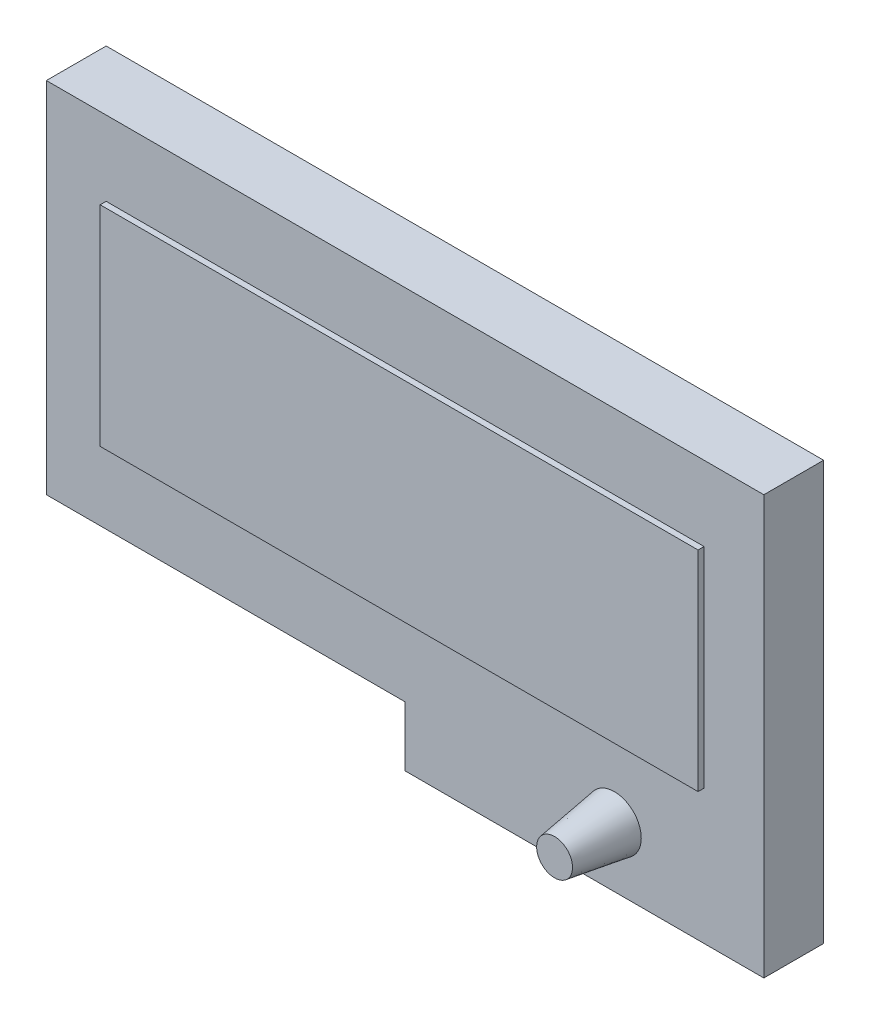
ISO-10303-21;
HEADER;
FILE_DESCRIPTION(('STEP AP214'),'2;1');
FILE_NAME('part.step','',(''),(''),'','','');
FILE_SCHEMA(('AUTOMOTIVE_DESIGN { 1 0 10303 214 1 1 1 1 }'));
ENDSEC;
DATA;
#1=APPLICATION_CONTEXT('core data for automotive mechanical design processes');
#2=APPLICATION_PROTOCOL_DEFINITION('international standard','automotive_design',2000,#1);
#3=PRODUCT_CONTEXT('',#1,'mechanical');
#4=PRODUCT('Part','Part','',(#3));
#5=PRODUCT_RELATED_PRODUCT_CATEGORY('part','',(#4));
#6=PRODUCT_DEFINITION_FORMATION('','',#4);
#7=PRODUCT_DEFINITION_CONTEXT('part definition',#1,'design');
#8=PRODUCT_DEFINITION('design','',#6,#7);
#9=PRODUCT_DEFINITION_SHAPE('','',#8);
#10=(LENGTH_UNIT() NAMED_UNIT(*) SI_UNIT(.MILLI.,.METRE.));
#11=(NAMED_UNIT(*) PLANE_ANGLE_UNIT() SI_UNIT($,.RADIAN.));
#12=(NAMED_UNIT(*) SI_UNIT($,.STERADIAN.) SOLID_ANGLE_UNIT());
#13=UNCERTAINTY_MEASURE_WITH_UNIT(LENGTH_MEASURE(1.E-05),#10,'distance_accuracy_value','');
#14=(GEOMETRIC_REPRESENTATION_CONTEXT(3) GLOBAL_UNCERTAINTY_ASSIGNED_CONTEXT((#13)) GLOBAL_UNIT_ASSIGNED_CONTEXT((#10,
#11,#12)) REPRESENTATION_CONTEXT('',''));
#15=CARTESIAN_POINT('',(0.,0.,0.));
#16=DIRECTION('',(0.,0.,1.));
#17=DIRECTION('',(1.,0.,0.));
#18=AXIS2_PLACEMENT_3D('',#15,#16,#17);
#19=CARTESIAN_POINT('',(0.,0.,10.));
#20=DIRECTION('',(0.,0.,1.));
#21=DIRECTION('',(1.,0.,0.));
#22=AXIS2_PLACEMENT_3D('',#19,#20,#21);
#23=PLANE('',#22);
#24=DIRECTION('',(1.,0.,0.));
#25=VECTOR('',#24,1.);
#26=CARTESIAN_POINT('',(-50.,12.5,10.));
#27=LINE('',#26,#25);
#28=CARTESIAN_POINT('',(-50.,12.5,10.));
#29=VERTEX_POINT('',#28);
#30=CARTESIAN_POINT('',(50.,12.5,10.));
#31=VERTEX_POINT('',#30);
#32=EDGE_CURVE('E178',#29,#31,#27,.T.);
#33=ORIENTED_EDGE('',*,*,#32,.F.);
#34=DIRECTION('',(0.,-1.,0.));
#35=VECTOR('',#34,1.);
#36=CARTESIAN_POINT('',(-50.,47.5,10.));
#37=LINE('',#36,#35);
#38=CARTESIAN_POINT('',(-50.,47.5,10.));
#39=VERTEX_POINT('',#38);
#40=EDGE_CURVE('E181',#39,#29,#37,.T.);
#41=ORIENTED_EDGE('',*,*,#40,.F.);
#42=DIRECTION('',(-1.,0.,0.));
#43=VECTOR('',#42,1.);
#44=CARTESIAN_POINT('',(-50.,47.5,10.));
#45=LINE('',#44,#43);
#46=CARTESIAN_POINT('',(50.,47.5,10.));
#47=VERTEX_POINT('',#46);
#48=EDGE_CURVE('E173',#47,#39,#45,.T.);
#49=ORIENTED_EDGE('',*,*,#48,.F.);
#50=DIRECTION('',(0.,1.,0.));
#51=VECTOR('',#50,1.);
#52=CARTESIAN_POINT('',(50.,47.5,10.));
#53=LINE('',#52,#51);
#54=EDGE_CURVE('E176',#31,#47,#53,.T.);
#55=ORIENTED_EDGE('',*,*,#54,.F.);
#56=EDGE_LOOP('',(#33,#41,#49,#55));
#57=FACE_BOUND('',#56,.T.);
#58=DIRECTION('',(-1.,0.,0.));
#59=VECTOR('',#58,1.);
#60=CARTESIAN_POINT('',(60.,60.,10.));
#61=LINE('',#60,#59);
#62=CARTESIAN_POINT('',(60.,60.,10.));
#63=VERTEX_POINT('',#62);
#64=CARTESIAN_POINT('',(-60.,60.,10.));
#65=VERTEX_POINT('',#64);
#66=EDGE_CURVE('E146',#63,#65,#61,.T.);
#67=ORIENTED_EDGE('',*,*,#66,.T.);
#68=DIRECTION('',(0.,-1.,0.));
#69=VECTOR('',#68,1.);
#70=CARTESIAN_POINT('',(-60.,60.,10.));
#71=LINE('',#70,#69);
#72=CARTESIAN_POINT('',(-60.,0.,10.));
#73=VERTEX_POINT('',#72);
#74=EDGE_CURVE('E95',#65,#73,#71,.T.);
#75=ORIENTED_EDGE('',*,*,#74,.T.);
#76=DIRECTION('',(1.,0.,0.));
#77=VECTOR('',#76,1.);
#78=CARTESIAN_POINT('',(-60.,0.,10.));
#79=LINE('',#78,#77);
#80=CARTESIAN_POINT('',(0.,0.,10.));
#81=VERTEX_POINT('',#80);
#82=EDGE_CURVE('E112',#73,#81,#79,.T.);
#83=ORIENTED_EDGE('',*,*,#82,.T.);
#84=DIRECTION('',(0.,-1.,0.));
#85=VECTOR('',#84,1.);
#86=CARTESIAN_POINT('',(0.,0.,10.));
#87=LINE('',#86,#85);
#88=CARTESIAN_POINT('',(0.,-10.,10.));
#89=VERTEX_POINT('',#88);
#90=EDGE_CURVE('E105',#81,#89,#87,.T.);
#91=ORIENTED_EDGE('',*,*,#90,.T.);
#92=DIRECTION('',(1.,0.,0.));
#93=VECTOR('',#92,1.);
#94=CARTESIAN_POINT('',(0.,-10.,10.));
#95=LINE('',#94,#93);
#96=CARTESIAN_POINT('',(60.,-10.,10.));
#97=VERTEX_POINT('',#96);
#98=EDGE_CURVE('E109',#89,#97,#95,.T.);
#99=ORIENTED_EDGE('',*,*,#98,.T.);
#100=DIRECTION('',(0.,1.,0.));
#101=VECTOR('',#100,1.);
#102=CARTESIAN_POINT('',(60.,-10.,10.));
#103=LINE('',#102,#101);
#104=EDGE_CURVE('E61',#97,#63,#103,.T.);
#105=ORIENTED_EDGE('',*,*,#104,.T.);
#106=EDGE_LOOP('',(#67,#75,#83,#91,#99,#105));
#107=FACE_BOUND('',#106,.T.);
#108=CARTESIAN_POINT('',(35.,0.,10.));
#109=DIRECTION('',(0.,0.,1.));
#110=DIRECTION('',(1.,0.,0.));
#111=AXIS2_PLACEMENT_3D('',#108,#109,#110);
#112=CIRCLE('',#111,4.5);
#113=CARTESIAN_POINT('',(39.5,0.,10.));
#114=VERTEX_POINT('',#113);
#115=EDGE_CURVE('E184',#114,#114,#112,.T.);
#116=ORIENTED_EDGE('',*,*,#115,.F.);
#117=EDGE_LOOP('',(#116));
#118=FACE_BOUND('',#117,.T.);
#119=ADVANCED_FACE('F37',(#57,#107,#118),#23,.T.);
#120=CARTESIAN_POINT('',(60.,60.,10.));
#121=DIRECTION('',(0.,-1.,0.));
#122=DIRECTION('',(1.,0.,0.));
#123=AXIS2_PLACEMENT_3D('',#120,#121,#122);
#124=PLANE('',#123);
#125=DIRECTION('',(-1.,0.,0.));
#126=VECTOR('',#125,1.);
#127=CARTESIAN_POINT('',(60.,60.,0.));
#128=LINE('',#127,#126);
#129=CARTESIAN_POINT('',(60.,60.,0.));
#130=VERTEX_POINT('',#129);
#131=CARTESIAN_POINT('',(-60.,60.,0.));
#132=VERTEX_POINT('',#131);
#133=EDGE_CURVE('E134',#130,#132,#128,.T.);
#134=ORIENTED_EDGE('',*,*,#133,.T.);
#135=DIRECTION('',(0.,0.,-1.));
#136=VECTOR('',#135,1.);
#137=CARTESIAN_POINT('',(-60.,60.,10.));
#138=LINE('',#137,#136);
#139=EDGE_CURVE('E12',#65,#132,#138,.T.);
#140=ORIENTED_EDGE('',*,*,#139,.F.);
#141=ORIENTED_EDGE('',*,*,#66,.F.);
#142=DIRECTION('',(0.,0.,-1.));
#143=VECTOR('',#142,1.);
#144=CARTESIAN_POINT('',(60.,60.,10.));
#145=LINE('',#144,#143);
#146=EDGE_CURVE('E130',#63,#130,#145,.T.);
#147=ORIENTED_EDGE('',*,*,#146,.T.);
#148=EDGE_LOOP('',(#134,#140,#141,#147));
#149=FACE_BOUND('',#148,.T.);
#150=ADVANCED_FACE('F39',(#149),#124,.F.);
#151=CARTESIAN_POINT('',(-60.,60.,10.));
#152=DIRECTION('',(1.,0.,0.));
#153=DIRECTION('',(0.,1.,0.));
#154=AXIS2_PLACEMENT_3D('',#151,#152,#153);
#155=PLANE('',#154);
#156=DIRECTION('',(0.,-1.,0.));
#157=VECTOR('',#156,1.);
#158=CARTESIAN_POINT('',(-60.,60.,0.));
#159=LINE('',#158,#157);
#160=CARTESIAN_POINT('',(-60.,0.,0.));
#161=VERTEX_POINT('',#160);
#162=EDGE_CURVE('E137',#132,#161,#159,.T.);
#163=ORIENTED_EDGE('',*,*,#162,.T.);
#164=DIRECTION('',(0.,0.,-1.));
#165=VECTOR('',#164,1.);
#166=CARTESIAN_POINT('',(-60.,0.,10.));
#167=LINE('',#166,#165);
#168=EDGE_CURVE('E45',#73,#161,#167,.T.);
#169=ORIENTED_EDGE('',*,*,#168,.F.);
#170=ORIENTED_EDGE('',*,*,#74,.F.);
#171=ORIENTED_EDGE('',*,*,#139,.T.);
#172=EDGE_LOOP('',(#163,#169,#170,#171));
#173=FACE_BOUND('',#172,.T.);
#174=ADVANCED_FACE('F249',(#173),#155,.F.);
#175=CARTESIAN_POINT('',(-60.,0.,10.));
#176=DIRECTION('',(0.,1.,0.));
#177=DIRECTION('',(-1.,0.,0.));
#178=AXIS2_PLACEMENT_3D('',#175,#176,#177);
#179=PLANE('',#178);
#180=DIRECTION('',(1.,0.,0.));
#181=VECTOR('',#180,1.);
#182=CARTESIAN_POINT('',(-60.,0.,0.));
#183=LINE('',#182,#181);
#184=CARTESIAN_POINT('',(0.,0.,0.));
#185=VERTEX_POINT('',#184);
#186=EDGE_CURVE('E140',#161,#185,#183,.T.);
#187=ORIENTED_EDGE('',*,*,#186,.T.);
#188=DIRECTION('',(0.,0.,-1.));
#189=VECTOR('',#188,1.);
#190=CARTESIAN_POINT('',(0.,0.,10.));
#191=LINE('',#190,#189);
#192=EDGE_CURVE('E125',#81,#185,#191,.T.);
#193=ORIENTED_EDGE('',*,*,#192,.F.);
#194=ORIENTED_EDGE('',*,*,#82,.F.);
#195=ORIENTED_EDGE('',*,*,#168,.T.);
#196=EDGE_LOOP('',(#187,#193,#194,#195));
#197=FACE_BOUND('',#196,.T.);
#198=ADVANCED_FACE('F152',(#197),#179,.F.);
#199=CARTESIAN_POINT('',(0.,0.,10.));
#200=DIRECTION('',(1.,0.,0.));
#201=DIRECTION('',(0.,1.,0.));
#202=AXIS2_PLACEMENT_3D('',#199,#200,#201);
#203=PLANE('',#202);
#204=DIRECTION('',(0.,-1.,0.));
#205=VECTOR('',#204,1.);
#206=CARTESIAN_POINT('',(0.,0.,0.));
#207=LINE('',#206,#205);
#208=CARTESIAN_POINT('',(0.,-10.,0.));
#209=VERTEX_POINT('',#208);
#210=EDGE_CURVE('E121',#185,#209,#207,.T.);
#211=ORIENTED_EDGE('',*,*,#210,.T.);
#212=DIRECTION('',(0.,0.,-1.));
#213=VECTOR('',#212,1.);
#214=CARTESIAN_POINT('',(0.,-10.,10.));
#215=LINE('',#214,#213);
#216=EDGE_CURVE('E118',#89,#209,#215,.T.);
#217=ORIENTED_EDGE('',*,*,#216,.F.);
#218=ORIENTED_EDGE('',*,*,#90,.F.);
#219=ORIENTED_EDGE('',*,*,#192,.T.);
#220=EDGE_LOOP('',(#211,#217,#218,#219));
#221=FACE_BOUND('',#220,.T.);
#222=ADVANCED_FACE('F119',(#221),#203,.F.);
#223=CARTESIAN_POINT('',(0.,-10.,10.));
#224=DIRECTION('',(0.,1.,0.));
#225=DIRECTION('',(0.,0.,1.));
#226=AXIS2_PLACEMENT_3D('',#223,#224,#225);
#227=PLANE('',#226);
#228=DIRECTION('',(1.,0.,0.));
#229=VECTOR('',#228,1.);
#230=CARTESIAN_POINT('',(0.,-10.,0.));
#231=LINE('',#230,#229);
#232=CARTESIAN_POINT('',(60.,-10.,0.));
#233=VERTEX_POINT('',#232);
#234=EDGE_CURVE('E143',#209,#233,#231,.T.);
#235=ORIENTED_EDGE('',*,*,#234,.T.);
#236=DIRECTION('',(0.,0.,-1.));
#237=VECTOR('',#236,1.);
#238=CARTESIAN_POINT('',(60.,-10.,10.));
#239=LINE('',#238,#237);
#240=EDGE_CURVE('E126',#97,#233,#239,.T.);
#241=ORIENTED_EDGE('',*,*,#240,.F.);
#242=ORIENTED_EDGE('',*,*,#98,.F.);
#243=ORIENTED_EDGE('',*,*,#216,.T.);
#244=EDGE_LOOP('',(#235,#241,#242,#243));
#245=FACE_BOUND('',#244,.T.);
#246=ADVANCED_FACE('F128',(#245),#227,.F.);
#247=CARTESIAN_POINT('',(60.,0.120312499999992,10.));
#248=DIRECTION('',(-1.,0.,0.));
#249=DIRECTION('',(0.,0.,1.));
#250=AXIS2_PLACEMENT_3D('',#247,#248,#249);
#251=PLANE('',#250);
#252=DIRECTION('',(0.,1.,0.));
#253=VECTOR('',#252,1.);
#254=CARTESIAN_POINT('',(60.,0.120312499999992,0.));
#255=LINE('',#254,#253);
#256=EDGE_CURVE('E87',#233,#130,#255,.T.);
#257=ORIENTED_EDGE('',*,*,#256,.T.);
#258=ORIENTED_EDGE('',*,*,#146,.F.);
#259=ORIENTED_EDGE('',*,*,#104,.F.);
#260=ORIENTED_EDGE('',*,*,#240,.T.);
#261=EDGE_LOOP('',(#257,#258,#259,#260));
#262=FACE_BOUND('',#261,.T.);
#263=ADVANCED_FACE('F156',(#262),#251,.F.);
#264=CARTESIAN_POINT('',(0.,0.,0.));
#265=DIRECTION('',(0.,0.,1.));
#266=DIRECTION('',(1.,0.,0.));
#267=AXIS2_PLACEMENT_3D('',#264,#265,#266);
#268=PLANE('',#267);
#269=ORIENTED_EDGE('',*,*,#133,.F.);
#270=ORIENTED_EDGE('',*,*,#256,.F.);
#271=ORIENTED_EDGE('',*,*,#234,.F.);
#272=ORIENTED_EDGE('',*,*,#210,.F.);
#273=ORIENTED_EDGE('',*,*,#186,.F.);
#274=ORIENTED_EDGE('',*,*,#162,.F.);
#275=EDGE_LOOP('',(#269,#270,#271,#272,#273,#274));
#276=FACE_BOUND('',#275,.T.);
#277=ADVANCED_FACE('F155',(#276),#268,.F.);
#278=CARTESIAN_POINT('',(-50.,47.5,11.));
#279=DIRECTION('',(1.,0.,0.));
#280=DIRECTION('',(0.,1.,0.));
#281=AXIS2_PLACEMENT_3D('',#278,#279,#280);
#282=PLANE('',#281);
#283=ORIENTED_EDGE('',*,*,#40,.T.);
#284=DIRECTION('',(0.,0.,-1.));
#285=VECTOR('',#284,1.);
#286=CARTESIAN_POINT('',(-50.,12.5,11.));
#287=LINE('',#286,#285);
#288=CARTESIAN_POINT('',(-50.,12.5,11.));
#289=VERTEX_POINT('',#288);
#290=EDGE_CURVE('E138',#289,#29,#287,.T.);
#291=ORIENTED_EDGE('',*,*,#290,.F.);
#292=DIRECTION('',(0.,-1.,0.));
#293=VECTOR('',#292,1.);
#294=CARTESIAN_POINT('',(-50.,47.5,11.));
#295=LINE('',#294,#293);
#296=CARTESIAN_POINT('',(-50.,47.5,11.));
#297=VERTEX_POINT('',#296);
#298=EDGE_CURVE('E175',#297,#289,#295,.T.);
#299=ORIENTED_EDGE('',*,*,#298,.F.);
#300=DIRECTION('',(0.,0.,-1.));
#301=VECTOR('',#300,1.);
#302=CARTESIAN_POINT('',(-50.,47.5,11.));
#303=LINE('',#302,#301);
#304=EDGE_CURVE('E169',#297,#39,#303,.T.);
#305=ORIENTED_EDGE('',*,*,#304,.T.);
#306=EDGE_LOOP('',(#283,#291,#299,#305));
#307=FACE_BOUND('',#306,.T.);
#308=ADVANCED_FACE('F232',(#307),#282,.F.);
#309=CARTESIAN_POINT('',(-50.,12.5,11.));
#310=DIRECTION('',(0.,1.,0.));
#311=DIRECTION('',(-1.,0.,0.));
#312=AXIS2_PLACEMENT_3D('',#309,#310,#311);
#313=PLANE('',#312);
#314=ORIENTED_EDGE('',*,*,#32,.T.);
#315=DIRECTION('',(0.,0.,-1.));
#316=VECTOR('',#315,1.);
#317=CARTESIAN_POINT('',(50.,12.5,11.));
#318=LINE('',#317,#316);
#319=CARTESIAN_POINT('',(50.,12.5,11.));
#320=VERTEX_POINT('',#319);
#321=EDGE_CURVE('E165',#320,#31,#318,.T.);
#322=ORIENTED_EDGE('',*,*,#321,.F.);
#323=DIRECTION('',(1.,0.,0.));
#324=VECTOR('',#323,1.);
#325=CARTESIAN_POINT('',(-50.,12.5,11.));
#326=LINE('',#325,#324);
#327=EDGE_CURVE('E190',#289,#320,#326,.T.);
#328=ORIENTED_EDGE('',*,*,#327,.F.);
#329=ORIENTED_EDGE('',*,*,#290,.T.);
#330=EDGE_LOOP('',(#314,#322,#328,#329));
#331=FACE_BOUND('',#330,.T.);
#332=ADVANCED_FACE('F228',(#331),#313,.F.);
#333=CARTESIAN_POINT('',(50.,47.5,11.));
#334=DIRECTION('',(-1.,0.,0.));
#335=DIRECTION('',(0.,0.,1.));
#336=AXIS2_PLACEMENT_3D('',#333,#334,#335);
#337=PLANE('',#336);
#338=ORIENTED_EDGE('',*,*,#54,.T.);
#339=DIRECTION('',(0.,0.,-1.));
#340=VECTOR('',#339,1.);
#341=CARTESIAN_POINT('',(50.,47.5,11.));
#342=LINE('',#341,#340);
#343=CARTESIAN_POINT('',(50.,47.5,11.));
#344=VERTEX_POINT('',#343);
#345=EDGE_CURVE('E52',#344,#47,#342,.T.);
#346=ORIENTED_EDGE('',*,*,#345,.F.);
#347=DIRECTION('',(0.,1.,0.));
#348=VECTOR('',#347,1.);
#349=CARTESIAN_POINT('',(50.,47.5,11.));
#350=LINE('',#349,#348);
#351=EDGE_CURVE('E187',#320,#344,#350,.T.);
#352=ORIENTED_EDGE('',*,*,#351,.F.);
#353=ORIENTED_EDGE('',*,*,#321,.T.);
#354=EDGE_LOOP('',(#338,#346,#352,#353));
#355=FACE_BOUND('',#354,.T.);
#356=ADVANCED_FACE('F225',(#355),#337,.F.);
#357=CARTESIAN_POINT('',(-50.,47.5,11.));
#358=DIRECTION('',(0.,-1.,0.));
#359=DIRECTION('',(1.,0.,0.));
#360=AXIS2_PLACEMENT_3D('',#357,#358,#359);
#361=PLANE('',#360);
#362=ORIENTED_EDGE('',*,*,#48,.T.);
#363=ORIENTED_EDGE('',*,*,#304,.F.);
#364=DIRECTION('',(-1.,0.,0.));
#365=VECTOR('',#364,1.);
#366=CARTESIAN_POINT('',(-50.,47.5,11.));
#367=LINE('',#366,#365);
#368=EDGE_CURVE('E172',#344,#297,#367,.T.);
#369=ORIENTED_EDGE('',*,*,#368,.F.);
#370=ORIENTED_EDGE('',*,*,#345,.T.);
#371=EDGE_LOOP('',(#362,#363,#369,#370));
#372=FACE_BOUND('',#371,.T.);
#373=ADVANCED_FACE('F221',(#372),#361,.F.);
#374=CARTESIAN_POINT('',(0.,0.,11.));
#375=DIRECTION('',(0.,0.,1.));
#376=DIRECTION('',(1.,0.,0.));
#377=AXIS2_PLACEMENT_3D('',#374,#375,#376);
#378=PLANE('',#377);
#379=ORIENTED_EDGE('',*,*,#298,.T.);
#380=ORIENTED_EDGE('',*,*,#327,.T.);
#381=ORIENTED_EDGE('',*,*,#351,.T.);
#382=ORIENTED_EDGE('',*,*,#368,.T.);
#383=EDGE_LOOP('',(#379,#380,#381,#382));
#384=FACE_BOUND('',#383,.T.);
#385=ADVANCED_FACE('F216',(#384),#378,.T.);
#386=CARTESIAN_POINT('',(35.,0.,20.));
#387=DIRECTION('',(0.,0.,1.));
#388=DIRECTION('',(1.,0.,0.));
#389=AXIS2_PLACEMENT_3D('',#386,#387,#388);
#390=PLANE('',#389);
#391=CARTESIAN_POINT('',(35.,0.,20.));
#392=DIRECTION('',(0.,0.,1.));
#393=DIRECTION('',(1.,0.,0.));
#394=AXIS2_PLACEMENT_3D('',#391,#392,#393);
#395=CIRCLE('',#394,3.);
#396=CARTESIAN_POINT('',(38.,0.,20.));
#397=VERTEX_POINT('',#396);
#398=EDGE_CURVE('E197',#397,#397,#395,.T.);
#399=ORIENTED_EDGE('',*,*,#398,.T.);
#400=EDGE_LOOP('',(#399));
#401=FACE_BOUND('',#400,.T.);
#402=ADVANCED_FACE('F205',(#401),#390,.T.);
#403=CARTESIAN_POINT('',(35.,0.,20.));
#404=DIRECTION('',(0.,0.,-1.));
#405=DIRECTION('',(-1.,0.,0.));
#406=AXIS2_PLACEMENT_3D('',#403,#404,#405);
#407=CONICAL_SURFACE('',#406,3.,0.148889947609497);
#408=ORIENTED_EDGE('',*,*,#115,.T.);
#409=EDGE_LOOP('',(#408));
#410=FACE_BOUND('',#409,.T.);
#411=ORIENTED_EDGE('',*,*,#398,.F.);
#412=EDGE_LOOP('',(#411));
#413=FACE_BOUND('',#412,.T.);
#414=ADVANCED_FACE('F215',(#410,#413),#407,.T.);
#415=CLOSED_SHELL('',(#119,#150,#174,#198,#222,#246,#263,#277,#308,#332,#356,#373,#385,#402,#414));
#416=MANIFOLD_SOLID_BREP('B2',#415);
#417=ADVANCED_BREP_SHAPE_REPRESENTATION('',(#18,#416),#14);
#418=SHAPE_DEFINITION_REPRESENTATION(#9,#417);
ENDSEC;
END-ISO-10303-21;
